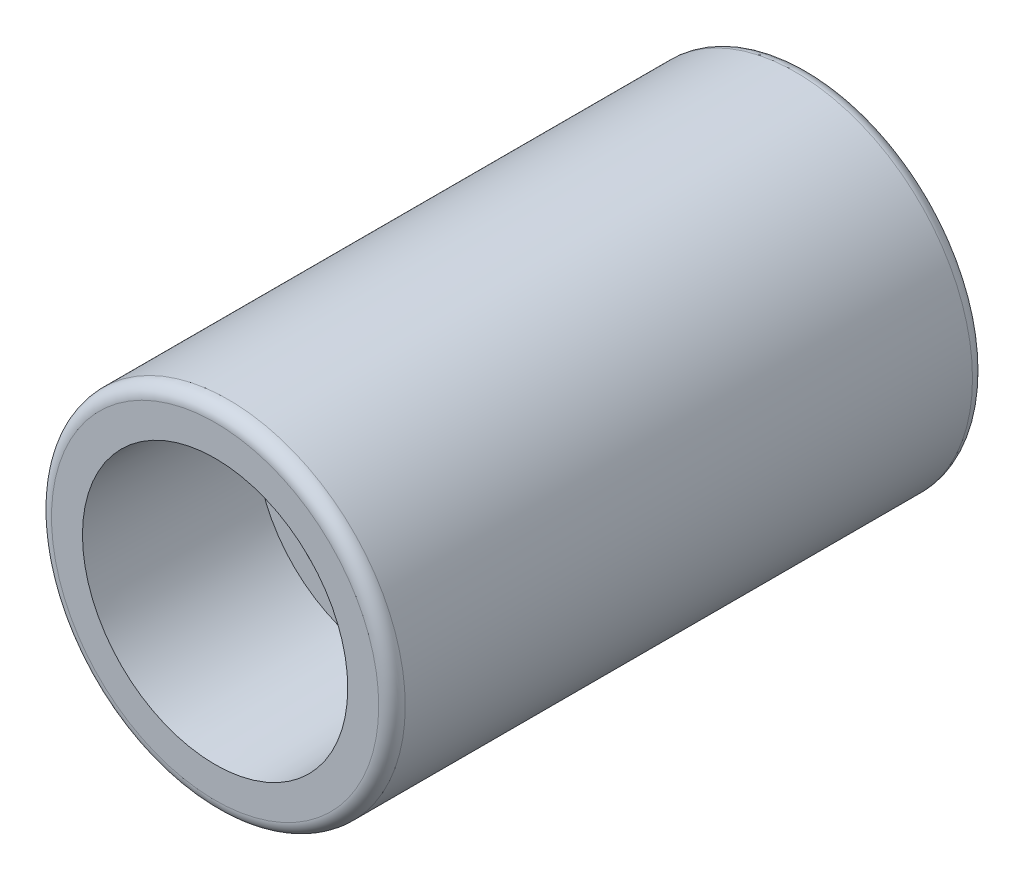
ISO-10303-21;
HEADER;
FILE_DESCRIPTION(('STEP AP214'),'2;1');
FILE_NAME('part.step','',(''),(''),'','','');
FILE_SCHEMA(('AUTOMOTIVE_DESIGN { 1 0 10303 214 1 1 1 1 }'));
ENDSEC;
DATA;
#1=APPLICATION_CONTEXT('core data for automotive mechanical design processes');
#2=APPLICATION_PROTOCOL_DEFINITION('international standard','automotive_design',2000,#1);
#3=PRODUCT_CONTEXT('',#1,'mechanical');
#4=PRODUCT('Part','Part','',(#3));
#5=PRODUCT_RELATED_PRODUCT_CATEGORY('part','',(#4));
#6=PRODUCT_DEFINITION_FORMATION('','',#4);
#7=PRODUCT_DEFINITION_CONTEXT('part definition',#1,'design');
#8=PRODUCT_DEFINITION('design','',#6,#7);
#9=PRODUCT_DEFINITION_SHAPE('','',#8);
#10=(LENGTH_UNIT() NAMED_UNIT(*) SI_UNIT(.MILLI.,.METRE.));
#11=(NAMED_UNIT(*) PLANE_ANGLE_UNIT() SI_UNIT($,.RADIAN.));
#12=(NAMED_UNIT(*) SI_UNIT($,.STERADIAN.) SOLID_ANGLE_UNIT());
#13=UNCERTAINTY_MEASURE_WITH_UNIT(LENGTH_MEASURE(1.E-05),#10,'distance_accuracy_value','');
#14=(GEOMETRIC_REPRESENTATION_CONTEXT(3) GLOBAL_UNCERTAINTY_ASSIGNED_CONTEXT((#13)) GLOBAL_UNIT_ASSIGNED_CONTEXT((#10,
#11,#12)) REPRESENTATION_CONTEXT('',''));
#15=CARTESIAN_POINT('',(0.,0.,0.));
#16=DIRECTION('',(0.,0.,1.));
#17=DIRECTION('',(1.,0.,0.));
#18=AXIS2_PLACEMENT_3D('',#15,#16,#17);
#19=CARTESIAN_POINT('',(1.11022302462516E-13,0.,23.876));
#20=DIRECTION('',(0.,0.,-1.));
#21=DIRECTION('',(-1.,0.,0.));
#22=AXIS2_PLACEMENT_3D('',#19,#20,#21);
#23=CYLINDRICAL_SURFACE('',#22,14.224);
#24=CARTESIAN_POINT('',(1.11022302462516E-13,0.,22.8092));
#25=DIRECTION('',(0.,0.,1.));
#26=DIRECTION('',(1.,0.,0.));
#27=AXIS2_PLACEMENT_3D('',#24,#25,#26);
#28=CIRCLE('',#27,14.224);
#29=CARTESIAN_POINT('',(14.2240000000001,0.,22.8092));
#30=VERTEX_POINT('',#29);
#31=EDGE_CURVE('E40',#30,#30,#28,.F.);
#32=ORIENTED_EDGE('',*,*,#31,.T.);
#33=EDGE_LOOP('',(#32));
#34=FACE_BOUND('',#33,.T.);
#35=CARTESIAN_POINT('',(4.44089209850063E-13,0.,-22.8092));
#36=DIRECTION('',(0.,0.,1.));
#37=DIRECTION('',(1.,0.,0.));
#38=AXIS2_PLACEMENT_3D('',#35,#36,#37);
#39=CIRCLE('',#38,14.224);
#40=CARTESIAN_POINT('',(14.2240000000005,0.,-22.8092));
#41=VERTEX_POINT('',#40);
#42=EDGE_CURVE('E44',#41,#41,#39,.T.);
#43=ORIENTED_EDGE('',*,*,#42,.T.);
#44=EDGE_LOOP('',(#43));
#45=FACE_BOUND('',#44,.T.);
#46=ADVANCED_FACE('F32',(#34,#45),#23,.T.);
#47=CARTESIAN_POINT('',(1.11022302462516E-13,0.,23.876));
#48=DIRECTION('',(0.,0.,1.));
#49=DIRECTION('',(1.,0.,0.));
#50=AXIS2_PLACEMENT_3D('',#47,#48,#49);
#51=PLANE('',#50);
#52=CARTESIAN_POINT('',(1.11022302462516E-13,0.,23.876));
#53=DIRECTION('',(0.,0.,1.));
#54=DIRECTION('',(1.,0.,0.));
#55=AXIS2_PLACEMENT_3D('',#52,#53,#54);
#56=CIRCLE('',#55,13.1572);
#57=CARTESIAN_POINT('',(13.1572000000001,0.,23.876));
#58=VERTEX_POINT('',#57);
#59=EDGE_CURVE('E49',#58,#58,#56,.T.);
#60=ORIENTED_EDGE('',*,*,#59,.T.);
#61=EDGE_LOOP('',(#60));
#62=FACE_BOUND('',#61,.T.);
#63=CARTESIAN_POINT('',(1.11022302462516E-13,0.,23.876));
#64=DIRECTION('',(0.,0.,-1.));
#65=DIRECTION('',(-1.,0.,0.));
#66=AXIS2_PLACEMENT_3D('',#63,#64,#65);
#67=CIRCLE('',#66,10.668);
#68=CARTESIAN_POINT('',(-10.6679999999999,0.,23.876));
#69=VERTEX_POINT('',#68);
#70=EDGE_CURVE('E58',#69,#69,#67,.T.);
#71=ORIENTED_EDGE('',*,*,#70,.T.);
#72=EDGE_LOOP('',(#71));
#73=FACE_BOUND('',#72,.T.);
#74=ADVANCED_FACE('F74',(#62,#73),#51,.T.);
#75=CARTESIAN_POINT('',(4.44089209850063E-13,0.,-23.876));
#76=DIRECTION('',(0.,0.,1.));
#77=DIRECTION('',(1.,0.,0.));
#78=AXIS2_PLACEMENT_3D('',#75,#76,#77);
#79=PLANE('',#78);
#80=CARTESIAN_POINT('',(4.44089209850063E-13,0.,-23.876));
#81=DIRECTION('',(0.,0.,-1.));
#82=DIRECTION('',(-1.,0.,0.));
#83=AXIS2_PLACEMENT_3D('',#80,#81,#82);
#84=CIRCLE('',#83,10.668);
#85=CARTESIAN_POINT('',(-10.6679999999996,0.,-23.876));
#86=VERTEX_POINT('',#85);
#87=EDGE_CURVE('E64',#86,#86,#84,.T.);
#88=ORIENTED_EDGE('',*,*,#87,.F.);
#89=EDGE_LOOP('',(#88));
#90=FACE_BOUND('',#89,.T.);
#91=CARTESIAN_POINT('',(4.44089209850063E-13,0.,-23.876));
#92=DIRECTION('',(0.,0.,1.));
#93=DIRECTION('',(1.,0.,0.));
#94=AXIS2_PLACEMENT_3D('',#91,#92,#93);
#95=CIRCLE('',#94,13.1572);
#96=CARTESIAN_POINT('',(13.1572000000005,0.,-23.876));
#97=VERTEX_POINT('',#96);
#98=EDGE_CURVE('E10',#97,#97,#95,.F.);
#99=ORIENTED_EDGE('',*,*,#98,.T.);
#100=EDGE_LOOP('',(#99));
#101=FACE_BOUND('',#100,.T.);
#102=ADVANCED_FACE('F71',(#90,#101),#79,.F.);
#103=CARTESIAN_POINT('',(-1.11022302462516E-13,0.,48.0149284534339));
#104=DIRECTION('',(0.,0.,-1.));
#105=DIRECTION('',(-1.,0.,0.));
#106=AXIS2_PLACEMENT_3D('',#103,#104,#105);
#107=CYLINDRICAL_SURFACE('',#106,8.5344);
#108=CARTESIAN_POINT('',(1.11022302462516E-13,0.,-10.32002));
#109=DIRECTION('',(0.,0.,1.));
#110=DIRECTION('',(1.,0.,0.));
#111=AXIS2_PLACEMENT_3D('',#108,#109,#110);
#112=CIRCLE('',#111,8.5344);
#113=CARTESIAN_POINT('',(8.53440000000013,0.,-10.32002));
#114=VERTEX_POINT('',#113);
#115=EDGE_CURVE('E36',#114,#114,#112,.T.);
#116=ORIENTED_EDGE('',*,*,#115,.F.);
#117=EDGE_LOOP('',(#116));
#118=FACE_BOUND('',#117,.T.);
#119=CARTESIAN_POINT('',(-1.11022302462516E-13,0.,10.32002));
#120=DIRECTION('',(0.,0.,-1.));
#121=DIRECTION('',(-1.,0.,0.));
#122=AXIS2_PLACEMENT_3D('',#119,#120,#121);
#123=CIRCLE('',#122,8.5344);
#124=CARTESIAN_POINT('',(-8.53440000000013,0.,10.32002));
#125=VERTEX_POINT('',#124);
#126=EDGE_CURVE('E52',#125,#125,#123,.T.);
#127=ORIENTED_EDGE('',*,*,#126,.F.);
#128=EDGE_LOOP('',(#127));
#129=FACE_BOUND('',#128,.T.);
#130=ADVANCED_FACE('F73',(#118,#129),#107,.F.);
#131=CARTESIAN_POINT('',(-1.11022302462516E-13,0.,10.32002));
#132=DIRECTION('',(0.,0.,-1.));
#133=DIRECTION('',(-1.,0.,0.));
#134=AXIS2_PLACEMENT_3D('',#131,#132,#133);
#135=PLANE('',#134);
#136=ORIENTED_EDGE('',*,*,#126,.T.);
#137=EDGE_LOOP('',(#136));
#138=FACE_BOUND('',#137,.T.);
#139=CARTESIAN_POINT('',(-1.11022302462516E-13,0.,10.32002));
#140=DIRECTION('',(0.,0.,-1.));
#141=DIRECTION('',(-1.,0.,0.));
#142=AXIS2_PLACEMENT_3D('',#139,#140,#141);
#143=CIRCLE('',#142,10.2459332992275);
#144=CARTESIAN_POINT('',(-10.2459332992276,0.,10.32002));
#145=VERTEX_POINT('',#144);
#146=EDGE_CURVE('E55',#145,#145,#143,.T.);
#147=ORIENTED_EDGE('',*,*,#146,.F.);
#148=EDGE_LOOP('',(#147));
#149=FACE_BOUND('',#148,.T.);
#150=ADVANCED_FACE('F80',(#138,#149),#135,.F.);
#151=CARTESIAN_POINT('',(-1.11022302462516E-13,0.,10.32002));
#152=DIRECTION('',(0.,0.,1.));
#153=DIRECTION('',(1.,0.,0.));
#154=AXIS2_PLACEMENT_3D('',#151,#152,#153);
#155=CONICAL_SURFACE('',#154,10.2459332992275,0.0311250383272254);
#156=ORIENTED_EDGE('',*,*,#70,.F.);
#157=EDGE_LOOP('',(#156));
#158=FACE_BOUND('',#157,.T.);
#159=ORIENTED_EDGE('',*,*,#146,.T.);
#160=EDGE_LOOP('',(#159));
#161=FACE_BOUND('',#160,.T.);
#162=ADVANCED_FACE('F93',(#158,#161),#155,.F.);
#163=CARTESIAN_POINT('',(1.11022302462516E-13,0.,22.8092));
#164=DIRECTION('',(0.,0.,1.));
#165=DIRECTION('',(1.,0.,0.));
#166=AXIS2_PLACEMENT_3D('',#163,#164,#165);
#167=TOROIDAL_SURFACE('',#166,13.1572,1.0668);
#168=ORIENTED_EDGE('',*,*,#31,.F.);
#169=EDGE_LOOP('',(#168));
#170=FACE_BOUND('',#169,.T.);
#171=ORIENTED_EDGE('',*,*,#59,.F.);
#172=EDGE_LOOP('',(#171));
#173=FACE_BOUND('',#172,.T.);
#174=ADVANCED_FACE('F91',(#170,#173),#167,.T.);
#175=CARTESIAN_POINT('',(4.44089209850063E-13,0.,-22.8092));
#176=DIRECTION('',(0.,0.,1.));
#177=DIRECTION('',(1.,0.,0.));
#178=AXIS2_PLACEMENT_3D('',#175,#176,#177);
#179=TOROIDAL_SURFACE('',#178,13.1572,1.0668);
#180=ORIENTED_EDGE('',*,*,#98,.F.);
#181=EDGE_LOOP('',(#180));
#182=FACE_BOUND('',#181,.T.);
#183=ORIENTED_EDGE('',*,*,#42,.F.);
#184=EDGE_LOOP('',(#183));
#185=FACE_BOUND('',#184,.T.);
#186=ADVANCED_FACE('F34',(#182,#185),#179,.T.);
#187=CARTESIAN_POINT('',(1.11022302462516E-13,0.,-10.32002));
#188=DIRECTION('',(0.,0.,1.));
#189=DIRECTION('',(-1.,0.,0.));
#190=AXIS2_PLACEMENT_3D('',#187,#188,#189);
#191=PLANE('',#190);
#192=ORIENTED_EDGE('',*,*,#115,.T.);
#193=EDGE_LOOP('',(#192));
#194=FACE_BOUND('',#193,.T.);
#195=CARTESIAN_POINT('',(1.11022302462516E-13,0.,-10.32002));
#196=DIRECTION('',(0.,0.,-1.));
#197=DIRECTION('',(-1.,0.,0.));
#198=AXIS2_PLACEMENT_3D('',#195,#196,#197);
#199=CIRCLE('',#198,10.2459332992275);
#200=CARTESIAN_POINT('',(-10.2459332992274,0.,-10.32002));
#201=VERTEX_POINT('',#200);
#202=EDGE_CURVE('E61',#201,#201,#199,.T.);
#203=ORIENTED_EDGE('',*,*,#202,.T.);
#204=EDGE_LOOP('',(#203));
#205=FACE_BOUND('',#204,.T.);
#206=ADVANCED_FACE('F99',(#194,#205),#191,.F.);
#207=CARTESIAN_POINT('',(1.11022302462516E-13,0.,-10.32002));
#208=DIRECTION('',(0.,0.,-1.));
#209=DIRECTION('',(1.,0.,0.));
#210=AXIS2_PLACEMENT_3D('',#207,#208,#209);
#211=CONICAL_SURFACE('',#210,10.2459332992275,0.0311250383272254);
#212=ORIENTED_EDGE('',*,*,#87,.T.);
#213=EDGE_LOOP('',(#212));
#214=FACE_BOUND('',#213,.T.);
#215=ORIENTED_EDGE('',*,*,#202,.F.);
#216=EDGE_LOOP('',(#215));
#217=FACE_BOUND('',#216,.T.);
#218=ADVANCED_FACE('F68',(#214,#217),#211,.F.);
#219=CLOSED_SHELL('',(#46,#74,#102,#130,#150,#162,#174,#186,#206,#218));
#220=MANIFOLD_SOLID_BREP('B2',#219);
#221=ADVANCED_BREP_SHAPE_REPRESENTATION('',(#18,#220),#14);
#222=SHAPE_DEFINITION_REPRESENTATION(#9,#221);
ENDSEC;
END-ISO-10303-21;
